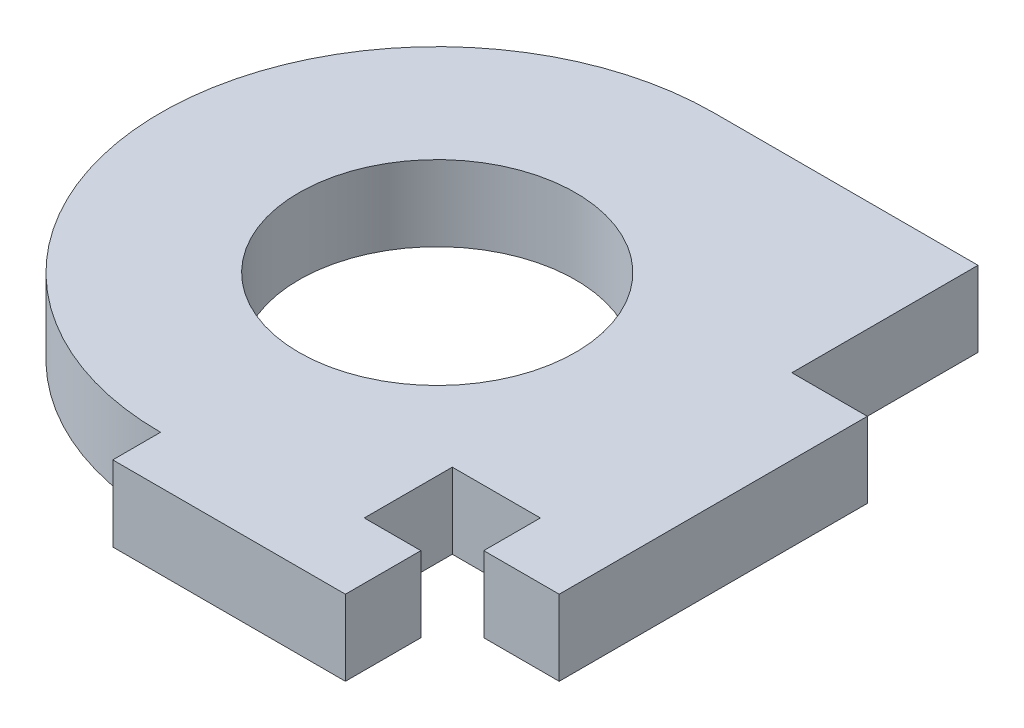
ISO-10303-21;
HEADER;
FILE_DESCRIPTION(('STEP AP214'),'2;1');
FILE_NAME('part.step','',(''),(''),'','','');
FILE_SCHEMA(('AUTOMOTIVE_DESIGN { 1 0 10303 214 1 1 1 1 }'));
ENDSEC;
DATA;
#1=APPLICATION_CONTEXT('core data for automotive mechanical design processes');
#2=APPLICATION_PROTOCOL_DEFINITION('international standard','automotive_design',2000,#1);
#3=PRODUCT_CONTEXT('',#1,'mechanical');
#4=PRODUCT('Part','Part','',(#3));
#5=PRODUCT_RELATED_PRODUCT_CATEGORY('part','',(#4));
#6=PRODUCT_DEFINITION_FORMATION('','',#4);
#7=PRODUCT_DEFINITION_CONTEXT('part definition',#1,'design');
#8=PRODUCT_DEFINITION('design','',#6,#7);
#9=PRODUCT_DEFINITION_SHAPE('','',#8);
#10=(LENGTH_UNIT() NAMED_UNIT(*) SI_UNIT(.MILLI.,.METRE.));
#11=(NAMED_UNIT(*) PLANE_ANGLE_UNIT() SI_UNIT($,.RADIAN.));
#12=(NAMED_UNIT(*) SI_UNIT($,.STERADIAN.) SOLID_ANGLE_UNIT());
#13=UNCERTAINTY_MEASURE_WITH_UNIT(LENGTH_MEASURE(1.E-05),#10,'distance_accuracy_value','');
#14=(GEOMETRIC_REPRESENTATION_CONTEXT(3) GLOBAL_UNCERTAINTY_ASSIGNED_CONTEXT((#13)) GLOBAL_UNIT_ASSIGNED_CONTEXT((#10,
#11,#12)) REPRESENTATION_CONTEXT('',''));
#15=CARTESIAN_POINT('',(0.,0.,0.));
#16=DIRECTION('',(0.,0.,1.));
#17=DIRECTION('',(1.,0.,0.));
#18=AXIS2_PLACEMENT_3D('',#15,#16,#17);
#19=CARTESIAN_POINT('',(-14.,6.,-19.8));
#20=DIRECTION('',(0.,1.,0.));
#21=DIRECTION('',(0.,0.,1.));
#22=AXIS2_PLACEMENT_3D('',#19,#20,#21);
#23=PLANE('',#22);
#24=DIRECTION('',(-1.,0.,0.));
#25=VECTOR('',#24,1.);
#26=CARTESIAN_POINT('',(0.,6.,0.));
#27=LINE('',#26,#25);
#28=CARTESIAN_POINT('',(4.5,6.,0.));
#29=VERTEX_POINT('',#28);
#30=CARTESIAN_POINT('',(0.,6.,0.));
#31=VERTEX_POINT('',#30);
#32=EDGE_CURVE('E187',#29,#31,#27,.T.);
#33=ORIENTED_EDGE('',*,*,#32,.T.);
#34=DIRECTION('',(0.,0.,-1.));
#35=VECTOR('',#34,1.);
#36=CARTESIAN_POINT('',(0.,6.,0.));
#37=LINE('',#36,#35);
#38=CARTESIAN_POINT('',(0.,6.,-7.));
#39=VERTEX_POINT('',#38);
#40=EDGE_CURVE('E110',#31,#39,#37,.T.);
#41=ORIENTED_EDGE('',*,*,#40,.T.);
#42=DIRECTION('',(1.,0.,0.));
#43=VECTOR('',#42,1.);
#44=CARTESIAN_POINT('',(0.,6.,-7.));
#45=LINE('',#44,#43);
#46=CARTESIAN_POINT('',(7.,6.,-7.));
#47=VERTEX_POINT('',#46);
#48=EDGE_CURVE('E217',#39,#47,#45,.T.);
#49=ORIENTED_EDGE('',*,*,#48,.T.);
#50=DIRECTION('',(0.,0.,1.));
#51=VECTOR('',#50,1.);
#52=CARTESIAN_POINT('',(7.,6.,-7.));
#53=LINE('',#52,#51);
#54=CARTESIAN_POINT('',(7.,6.,-2.5));
#55=VERTEX_POINT('',#54);
#56=EDGE_CURVE('E236',#47,#55,#53,.T.);
#57=ORIENTED_EDGE('',*,*,#56,.T.);
#58=DIRECTION('',(1.,0.,0.));
#59=VECTOR('',#58,1.);
#60=CARTESIAN_POINT('',(7.,6.,-2.5));
#61=LINE('',#60,#59);
#62=CARTESIAN_POINT('',(13.,6.,-2.5));
#63=VERTEX_POINT('',#62);
#64=EDGE_CURVE('E233',#55,#63,#61,.T.);
#65=ORIENTED_EDGE('',*,*,#64,.T.);
#66=DIRECTION('',(0.,0.,-1.));
#67=VECTOR('',#66,1.);
#68=CARTESIAN_POINT('',(13.,6.,-2.5));
#69=LINE('',#68,#67);
#70=CARTESIAN_POINT('',(13.,6.,-27.));
#71=VERTEX_POINT('',#70);
#72=EDGE_CURVE('E235',#63,#71,#69,.T.);
#73=ORIENTED_EDGE('',*,*,#72,.T.);
#74=DIRECTION('',(-1.,0.,0.));
#75=VECTOR('',#74,1.);
#76=CARTESIAN_POINT('',(7.,6.,-27.));
#77=LINE('',#76,#75);
#78=CARTESIAN_POINT('',(7.,6.,-27.));
#79=VERTEX_POINT('',#78);
#80=EDGE_CURVE('E238',#71,#79,#77,.T.);
#81=ORIENTED_EDGE('',*,*,#80,.T.);
#82=DIRECTION('',(0.,0.,-1.));
#83=VECTOR('',#82,1.);
#84=CARTESIAN_POINT('',(7.,6.,-41.8));
#85=LINE('',#84,#83);
#86=CARTESIAN_POINT('',(7.,6.,-41.8));
#87=VERTEX_POINT('',#86);
#88=EDGE_CURVE('E244',#79,#87,#85,.T.);
#89=ORIENTED_EDGE('',*,*,#88,.T.);
#90=DIRECTION('',(-1.,0.,0.));
#91=VECTOR('',#90,1.);
#92=CARTESIAN_POINT('',(-14.,6.,-41.8));
#93=LINE('',#92,#91);
#94=CARTESIAN_POINT('',(-14.,6.,-41.8));
#95=VERTEX_POINT('',#94);
#96=EDGE_CURVE('E246',#87,#95,#93,.T.);
#97=ORIENTED_EDGE('',*,*,#96,.T.);
#98=CARTESIAN_POINT('',(-14.,6.,-19.8));
#99=DIRECTION('',(0.,1.,0.));
#100=DIRECTION('',(0.,0.,1.));
#101=AXIS2_PLACEMENT_3D('',#98,#99,#100);
#102=CIRCLE('',#101,22.);
#103=CARTESIAN_POINT('',(-14.,6.,2.2));
#104=VERTEX_POINT('',#103);
#105=EDGE_CURVE('E144',#95,#104,#102,.T.);
#106=ORIENTED_EDGE('',*,*,#105,.T.);
#107=DIRECTION('',(0.,0.,1.));
#108=VECTOR('',#107,1.);
#109=CARTESIAN_POINT('',(-14.,6.,2.2));
#110=LINE('',#109,#108);
#111=CARTESIAN_POINT('',(-14.,6.,6.));
#112=VERTEX_POINT('',#111);
#113=EDGE_CURVE('E138',#104,#112,#110,.T.);
#114=ORIENTED_EDGE('',*,*,#113,.T.);
#115=DIRECTION('',(1.,0.,0.));
#116=VECTOR('',#115,1.);
#117=CARTESIAN_POINT('',(-14.,6.,6.));
#118=LINE('',#117,#116);
#119=CARTESIAN_POINT('',(4.50000000000001,6.,6.));
#120=VERTEX_POINT('',#119);
#121=EDGE_CURVE('E142',#112,#120,#118,.T.);
#122=ORIENTED_EDGE('',*,*,#121,.T.);
#123=DIRECTION('',(0.,0.,-1.));
#124=VECTOR('',#123,1.);
#125=CARTESIAN_POINT('',(4.5,6.,0.));
#126=LINE('',#125,#124);
#127=EDGE_CURVE('E52',#120,#29,#126,.T.);
#128=ORIENTED_EDGE('',*,*,#127,.T.);
#129=EDGE_LOOP('',(#33,#41,#49,#57,#65,#73,#81,#89,#97,#106,#114,#122,#128));
#130=FACE_BOUND('',#129,.T.);
#131=CARTESIAN_POINT('',(-14.,6.,-19.8));
#132=DIRECTION('',(0.,1.,0.));
#133=DIRECTION('',(0.,0.,1.));
#134=AXIS2_PLACEMENT_3D('',#131,#132,#133);
#135=CIRCLE('',#134,11.);
#136=CARTESIAN_POINT('',(-14.,6.,-8.8));
#137=VERTEX_POINT('',#136);
#138=EDGE_CURVE('E166',#137,#137,#135,.T.);
#139=ORIENTED_EDGE('',*,*,#138,.F.);
#140=EDGE_LOOP('',(#139));
#141=FACE_BOUND('',#140,.T.);
#142=ADVANCED_FACE('F35',(#130,#141),#23,.T.);
#143=CARTESIAN_POINT('',(-14.,0.,-19.8));
#144=DIRECTION('',(0.,1.,0.));
#145=DIRECTION('',(0.,0.,1.));
#146=AXIS2_PLACEMENT_3D('',#143,#144,#145);
#147=PLANE('',#146);
#148=DIRECTION('',(-1.,0.,0.));
#149=VECTOR('',#148,1.);
#150=CARTESIAN_POINT('',(0.,0.,0.));
#151=LINE('',#150,#149);
#152=CARTESIAN_POINT('',(4.5,0.,0.));
#153=VERTEX_POINT('',#152);
#154=CARTESIAN_POINT('',(0.,0.,0.));
#155=VERTEX_POINT('',#154);
#156=EDGE_CURVE('E162',#153,#155,#151,.T.);
#157=ORIENTED_EDGE('',*,*,#156,.F.);
#158=DIRECTION('',(0.,0.,-1.));
#159=VECTOR('',#158,1.);
#160=CARTESIAN_POINT('',(4.5,0.,0.));
#161=LINE('',#160,#159);
#162=CARTESIAN_POINT('',(4.50000000000001,0.,6.));
#163=VERTEX_POINT('',#162);
#164=EDGE_CURVE('E102',#163,#153,#161,.T.);
#165=ORIENTED_EDGE('',*,*,#164,.F.);
#166=DIRECTION('',(1.,0.,0.));
#167=VECTOR('',#166,1.);
#168=CARTESIAN_POINT('',(-14.,0.,6.));
#169=LINE('',#168,#167);
#170=CARTESIAN_POINT('',(-14.,0.,6.));
#171=VERTEX_POINT('',#170);
#172=EDGE_CURVE('E96',#171,#163,#169,.T.);
#173=ORIENTED_EDGE('',*,*,#172,.F.);
#174=DIRECTION('',(0.,0.,1.));
#175=VECTOR('',#174,1.);
#176=CARTESIAN_POINT('',(-14.,0.,2.2));
#177=LINE('',#176,#175);
#178=CARTESIAN_POINT('',(-14.,0.,2.2));
#179=VERTEX_POINT('',#178);
#180=EDGE_CURVE('E152',#179,#171,#177,.T.);
#181=ORIENTED_EDGE('',*,*,#180,.F.);
#182=CARTESIAN_POINT('',(-14.,0.,-19.8));
#183=DIRECTION('',(0.,1.,0.));
#184=DIRECTION('',(0.,0.,1.));
#185=AXIS2_PLACEMENT_3D('',#182,#183,#184);
#186=CIRCLE('',#185,22.);
#187=CARTESIAN_POINT('',(-14.,0.,-41.8));
#188=VERTEX_POINT('',#187);
#189=EDGE_CURVE('E182',#188,#179,#186,.T.);
#190=ORIENTED_EDGE('',*,*,#189,.F.);
#191=DIRECTION('',(-1.,0.,0.));
#192=VECTOR('',#191,1.);
#193=CARTESIAN_POINT('',(-14.,0.,-41.8));
#194=LINE('',#193,#192);
#195=CARTESIAN_POINT('',(7.,0.,-41.8));
#196=VERTEX_POINT('',#195);
#197=EDGE_CURVE('E180',#196,#188,#194,.T.);
#198=ORIENTED_EDGE('',*,*,#197,.F.);
#199=DIRECTION('',(0.,0.,-1.));
#200=VECTOR('',#199,1.);
#201=CARTESIAN_POINT('',(7.,0.,-41.8));
#202=LINE('',#201,#200);
#203=CARTESIAN_POINT('',(7.,0.,-27.));
#204=VERTEX_POINT('',#203);
#205=EDGE_CURVE('E178',#204,#196,#202,.T.);
#206=ORIENTED_EDGE('',*,*,#205,.F.);
#207=DIRECTION('',(-1.,0.,0.));
#208=VECTOR('',#207,1.);
#209=CARTESIAN_POINT('',(7.,0.,-27.));
#210=LINE('',#209,#208);
#211=CARTESIAN_POINT('',(13.,0.,-27.));
#212=VERTEX_POINT('',#211);
#213=EDGE_CURVE('E176',#212,#204,#210,.T.);
#214=ORIENTED_EDGE('',*,*,#213,.F.);
#215=DIRECTION('',(0.,0.,-1.));
#216=VECTOR('',#215,1.);
#217=CARTESIAN_POINT('',(13.,0.,-2.5));
#218=LINE('',#217,#216);
#219=CARTESIAN_POINT('',(13.,0.,-2.5));
#220=VERTEX_POINT('',#219);
#221=EDGE_CURVE('E174',#220,#212,#218,.T.);
#222=ORIENTED_EDGE('',*,*,#221,.F.);
#223=DIRECTION('',(1.,0.,0.));
#224=VECTOR('',#223,1.);
#225=CARTESIAN_POINT('',(7.,0.,-2.5));
#226=LINE('',#225,#224);
#227=CARTESIAN_POINT('',(7.,0.,-2.5));
#228=VERTEX_POINT('',#227);
#229=EDGE_CURVE('E172',#228,#220,#226,.T.);
#230=ORIENTED_EDGE('',*,*,#229,.F.);
#231=DIRECTION('',(0.,0.,1.));
#232=VECTOR('',#231,1.);
#233=CARTESIAN_POINT('',(7.,0.,-7.));
#234=LINE('',#233,#232);
#235=CARTESIAN_POINT('',(7.,0.,-7.));
#236=VERTEX_POINT('',#235);
#237=EDGE_CURVE('E170',#236,#228,#234,.T.);
#238=ORIENTED_EDGE('',*,*,#237,.F.);
#239=DIRECTION('',(1.,0.,0.));
#240=VECTOR('',#239,1.);
#241=CARTESIAN_POINT('',(0.,0.,-7.));
#242=LINE('',#241,#240);
#243=CARTESIAN_POINT('',(0.,0.,-7.));
#244=VERTEX_POINT('',#243);
#245=EDGE_CURVE('E168',#244,#236,#242,.T.);
#246=ORIENTED_EDGE('',*,*,#245,.F.);
#247=DIRECTION('',(0.,0.,-1.));
#248=VECTOR('',#247,1.);
#249=CARTESIAN_POINT('',(0.,0.,0.));
#250=LINE('',#249,#248);
#251=EDGE_CURVE('E165',#155,#244,#250,.T.);
#252=ORIENTED_EDGE('',*,*,#251,.F.);
#253=EDGE_LOOP('',(#157,#165,#173,#181,#190,#198,#206,#214,#222,#230,#238,#246,#252));
#254=FACE_BOUND('',#253,.T.);
#255=CARTESIAN_POINT('',(-14.,0.,-19.8));
#256=DIRECTION('',(0.,1.,0.));
#257=DIRECTION('',(0.,0.,1.));
#258=AXIS2_PLACEMENT_3D('',#255,#256,#257);
#259=CIRCLE('',#258,11.);
#260=CARTESIAN_POINT('',(-14.,0.,-8.8));
#261=VERTEX_POINT('',#260);
#262=EDGE_CURVE('E406',#261,#261,#259,.T.);
#263=ORIENTED_EDGE('',*,*,#262,.T.);
#264=EDGE_LOOP('',(#263));
#265=FACE_BOUND('',#264,.T.);
#266=ADVANCED_FACE('F221',(#254,#265),#147,.F.);
#267=CARTESIAN_POINT('',(0.,6.,0.));
#268=DIRECTION('',(0.,0.,1.));
#269=DIRECTION('',(1.,0.,0.));
#270=AXIS2_PLACEMENT_3D('',#267,#268,#269);
#271=PLANE('',#270);
#272=ORIENTED_EDGE('',*,*,#156,.T.);
#273=DIRECTION('',(0.,-1.,0.));
#274=VECTOR('',#273,1.);
#275=CARTESIAN_POINT('',(0.,6.,0.));
#276=LINE('',#275,#274);
#277=EDGE_CURVE('E11',#31,#155,#276,.T.);
#278=ORIENTED_EDGE('',*,*,#277,.F.);
#279=ORIENTED_EDGE('',*,*,#32,.F.);
#280=DIRECTION('',(0.,-1.,0.));
#281=VECTOR('',#280,1.);
#282=CARTESIAN_POINT('',(4.5,6.,0.));
#283=LINE('',#282,#281);
#284=EDGE_CURVE('E158',#29,#153,#283,.T.);
#285=ORIENTED_EDGE('',*,*,#284,.T.);
#286=EDGE_LOOP('',(#272,#278,#279,#285));
#287=FACE_BOUND('',#286,.T.);
#288=ADVANCED_FACE('F37',(#287),#271,.F.);
#289=CARTESIAN_POINT('',(0.,6.,0.));
#290=DIRECTION('',(-1.,0.,0.));
#291=DIRECTION('',(0.,0.,1.));
#292=AXIS2_PLACEMENT_3D('',#289,#290,#291);
#293=PLANE('',#292);
#294=ORIENTED_EDGE('',*,*,#251,.T.);
#295=DIRECTION('',(0.,-1.,0.));
#296=VECTOR('',#295,1.);
#297=CARTESIAN_POINT('',(0.,6.,-7.));
#298=LINE('',#297,#296);
#299=EDGE_CURVE('E44',#39,#244,#298,.T.);
#300=ORIENTED_EDGE('',*,*,#299,.F.);
#301=ORIENTED_EDGE('',*,*,#40,.F.);
#302=ORIENTED_EDGE('',*,*,#277,.T.);
#303=EDGE_LOOP('',(#294,#300,#301,#302));
#304=FACE_BOUND('',#303,.T.);
#305=ADVANCED_FACE('F280',(#304),#293,.F.);
#306=CARTESIAN_POINT('',(0.,6.,-7.));
#307=DIRECTION('',(0.,0.,-1.));
#308=DIRECTION('',(-1.,0.,0.));
#309=AXIS2_PLACEMENT_3D('',#306,#307,#308);
#310=PLANE('',#309);
#311=ORIENTED_EDGE('',*,*,#245,.T.);
#312=DIRECTION('',(0.,-1.,0.));
#313=VECTOR('',#312,1.);
#314=CARTESIAN_POINT('',(7.,6.,-7.));
#315=LINE('',#314,#313);
#316=EDGE_CURVE('E209',#47,#236,#315,.T.);
#317=ORIENTED_EDGE('',*,*,#316,.F.);
#318=ORIENTED_EDGE('',*,*,#48,.F.);
#319=ORIENTED_EDGE('',*,*,#299,.T.);
#320=EDGE_LOOP('',(#311,#317,#318,#319));
#321=FACE_BOUND('',#320,.T.);
#322=ADVANCED_FACE('F215',(#321),#310,.F.);
#323=CARTESIAN_POINT('',(7.,6.,-7.));
#324=DIRECTION('',(1.,0.,0.));
#325=DIRECTION('',(0.,0.,-1.));
#326=AXIS2_PLACEMENT_3D('',#323,#324,#325);
#327=PLANE('',#326);
#328=ORIENTED_EDGE('',*,*,#237,.T.);
#329=DIRECTION('',(0.,-1.,0.));
#330=VECTOR('',#329,1.);
#331=CARTESIAN_POINT('',(7.,6.,-2.5));
#332=LINE('',#331,#330);
#333=EDGE_CURVE('E206',#55,#228,#332,.T.);
#334=ORIENTED_EDGE('',*,*,#333,.F.);
#335=ORIENTED_EDGE('',*,*,#56,.F.);
#336=ORIENTED_EDGE('',*,*,#316,.T.);
#337=EDGE_LOOP('',(#328,#334,#335,#336));
#338=FACE_BOUND('',#337,.T.);
#339=ADVANCED_FACE('F227',(#338),#327,.F.);
#340=CARTESIAN_POINT('',(7.,6.,-2.5));
#341=DIRECTION('',(0.,0.,-1.));
#342=DIRECTION('',(-1.,0.,0.));
#343=AXIS2_PLACEMENT_3D('',#340,#341,#342);
#344=PLANE('',#343);
#345=ORIENTED_EDGE('',*,*,#229,.T.);
#346=DIRECTION('',(0.,-1.,0.));
#347=VECTOR('',#346,1.);
#348=CARTESIAN_POINT('',(13.,6.,-2.5));
#349=LINE('',#348,#347);
#350=EDGE_CURVE('E203',#63,#220,#349,.T.);
#351=ORIENTED_EDGE('',*,*,#350,.F.);
#352=ORIENTED_EDGE('',*,*,#64,.F.);
#353=ORIENTED_EDGE('',*,*,#333,.T.);
#354=EDGE_LOOP('',(#345,#351,#352,#353));
#355=FACE_BOUND('',#354,.T.);
#356=ADVANCED_FACE('F231',(#355),#344,.F.);
#357=CARTESIAN_POINT('',(13.,6.,-2.5));
#358=DIRECTION('',(-1.,0.,0.));
#359=DIRECTION('',(0.,0.,1.));
#360=AXIS2_PLACEMENT_3D('',#357,#358,#359);
#361=PLANE('',#360);
#362=ORIENTED_EDGE('',*,*,#221,.T.);
#363=DIRECTION('',(0.,-1.,0.));
#364=VECTOR('',#363,1.);
#365=CARTESIAN_POINT('',(13.,6.,-27.));
#366=LINE('',#365,#364);
#367=EDGE_CURVE('E200',#71,#212,#366,.T.);
#368=ORIENTED_EDGE('',*,*,#367,.F.);
#369=ORIENTED_EDGE('',*,*,#72,.F.);
#370=ORIENTED_EDGE('',*,*,#350,.T.);
#371=EDGE_LOOP('',(#362,#368,#369,#370));
#372=FACE_BOUND('',#371,.T.);
#373=ADVANCED_FACE('F293',(#372),#361,.F.);
#374=CARTESIAN_POINT('',(7.,6.,-27.));
#375=DIRECTION('',(0.,0.,1.));
#376=DIRECTION('',(1.,0.,0.));
#377=AXIS2_PLACEMENT_3D('',#374,#375,#376);
#378=PLANE('',#377);
#379=ORIENTED_EDGE('',*,*,#213,.T.);
#380=DIRECTION('',(0.,-1.,0.));
#381=VECTOR('',#380,1.);
#382=CARTESIAN_POINT('',(7.,6.,-27.));
#383=LINE('',#382,#381);
#384=EDGE_CURVE('E197',#79,#204,#383,.T.);
#385=ORIENTED_EDGE('',*,*,#384,.F.);
#386=ORIENTED_EDGE('',*,*,#80,.F.);
#387=ORIENTED_EDGE('',*,*,#367,.T.);
#388=EDGE_LOOP('',(#379,#385,#386,#387));
#389=FACE_BOUND('',#388,.T.);
#390=ADVANCED_FACE('F296',(#389),#378,.F.);
#391=CARTESIAN_POINT('',(7.,6.,-41.8));
#392=DIRECTION('',(-1.,0.,0.));
#393=DIRECTION('',(0.,0.,1.));
#394=AXIS2_PLACEMENT_3D('',#391,#392,#393);
#395=PLANE('',#394);
#396=ORIENTED_EDGE('',*,*,#205,.T.);
#397=DIRECTION('',(0.,-1.,0.));
#398=VECTOR('',#397,1.);
#399=CARTESIAN_POINT('',(7.,6.,-41.8));
#400=LINE('',#399,#398);
#401=EDGE_CURVE('E194',#87,#196,#400,.T.);
#402=ORIENTED_EDGE('',*,*,#401,.F.);
#403=ORIENTED_EDGE('',*,*,#88,.F.);
#404=ORIENTED_EDGE('',*,*,#384,.T.);
#405=EDGE_LOOP('',(#396,#402,#403,#404));
#406=FACE_BOUND('',#405,.T.);
#407=ADVANCED_FACE('F300',(#406),#395,.F.);
#408=CARTESIAN_POINT('',(-14.,6.,-41.8));
#409=DIRECTION('',(0.,0.,1.));
#410=DIRECTION('',(1.,0.,0.));
#411=AXIS2_PLACEMENT_3D('',#408,#409,#410);
#412=PLANE('',#411);
#413=ORIENTED_EDGE('',*,*,#197,.T.);
#414=DIRECTION('',(0.,-1.,0.));
#415=VECTOR('',#414,1.);
#416=CARTESIAN_POINT('',(-14.,6.,-41.8));
#417=LINE('',#416,#415);
#418=EDGE_CURVE('E191',#95,#188,#417,.T.);
#419=ORIENTED_EDGE('',*,*,#418,.F.);
#420=ORIENTED_EDGE('',*,*,#96,.F.);
#421=ORIENTED_EDGE('',*,*,#401,.T.);
#422=EDGE_LOOP('',(#413,#419,#420,#421));
#423=FACE_BOUND('',#422,.T.);
#424=ADVANCED_FACE('F252',(#423),#412,.F.);
#425=CARTESIAN_POINT('',(-14.,6.,-19.8));
#426=DIRECTION('',(0.,-1.,0.));
#427=DIRECTION('',(0.,0.,-1.));
#428=AXIS2_PLACEMENT_3D('',#425,#426,#427);
#429=CYLINDRICAL_SURFACE('',#428,22.);
#430=ORIENTED_EDGE('',*,*,#189,.T.);
#431=DIRECTION('',(0.,-1.,0.));
#432=VECTOR('',#431,1.);
#433=CARTESIAN_POINT('',(-14.,6.,2.2));
#434=LINE('',#433,#432);
#435=EDGE_CURVE('E153',#104,#179,#434,.T.);
#436=ORIENTED_EDGE('',*,*,#435,.F.);
#437=ORIENTED_EDGE('',*,*,#105,.F.);
#438=ORIENTED_EDGE('',*,*,#418,.T.);
#439=EDGE_LOOP('',(#430,#436,#437,#438));
#440=FACE_BOUND('',#439,.T.);
#441=ADVANCED_FACE('F256',(#440),#429,.T.);
#442=CARTESIAN_POINT('',(-14.,6.,2.2));
#443=DIRECTION('',(1.,0.,0.));
#444=DIRECTION('',(0.,0.,-1.));
#445=AXIS2_PLACEMENT_3D('',#442,#443,#444);
#446=PLANE('',#445);
#447=ORIENTED_EDGE('',*,*,#180,.T.);
#448=DIRECTION('',(0.,-1.,0.));
#449=VECTOR('',#448,1.);
#450=CARTESIAN_POINT('',(-14.,6.,6.));
#451=LINE('',#450,#449);
#452=EDGE_CURVE('E149',#112,#171,#451,.T.);
#453=ORIENTED_EDGE('',*,*,#452,.F.);
#454=ORIENTED_EDGE('',*,*,#113,.F.);
#455=ORIENTED_EDGE('',*,*,#435,.T.);
#456=EDGE_LOOP('',(#447,#453,#454,#455));
#457=FACE_BOUND('',#456,.T.);
#458=ADVANCED_FACE('F150',(#457),#446,.F.);
#459=CARTESIAN_POINT('',(-14.,6.,6.));
#460=DIRECTION('',(0.,0.,-1.));
#461=DIRECTION('',(-1.,0.,0.));
#462=AXIS2_PLACEMENT_3D('',#459,#460,#461);
#463=PLANE('',#462);
#464=ORIENTED_EDGE('',*,*,#172,.T.);
#465=DIRECTION('',(0.,-1.,0.));
#466=VECTOR('',#465,1.);
#467=CARTESIAN_POINT('',(4.50000000000001,6.,6.));
#468=LINE('',#467,#466);
#469=EDGE_CURVE('E154',#120,#163,#468,.T.);
#470=ORIENTED_EDGE('',*,*,#469,.F.);
#471=ORIENTED_EDGE('',*,*,#121,.F.);
#472=ORIENTED_EDGE('',*,*,#452,.T.);
#473=EDGE_LOOP('',(#464,#470,#471,#472));
#474=FACE_BOUND('',#473,.T.);
#475=ADVANCED_FACE('F156',(#474),#463,.F.);
#476=CARTESIAN_POINT('',(4.5,6.,0.));
#477=DIRECTION('',(-1.,0.,0.));
#478=DIRECTION('',(0.,0.,1.));
#479=AXIS2_PLACEMENT_3D('',#476,#477,#478);
#480=PLANE('',#479);
#481=ORIENTED_EDGE('',*,*,#164,.T.);
#482=ORIENTED_EDGE('',*,*,#284,.F.);
#483=ORIENTED_EDGE('',*,*,#127,.F.);
#484=ORIENTED_EDGE('',*,*,#469,.T.);
#485=EDGE_LOOP('',(#481,#482,#483,#484));
#486=FACE_BOUND('',#485,.T.);
#487=ADVANCED_FACE('F260',(#486),#480,.F.);
#488=CARTESIAN_POINT('',(-14.,6.,-19.8));
#489=DIRECTION('',(0.,-1.,0.));
#490=DIRECTION('',(0.,0.,-1.));
#491=AXIS2_PLACEMENT_3D('',#488,#489,#490);
#492=CYLINDRICAL_SURFACE('',#491,11.);
#493=ORIENTED_EDGE('',*,*,#138,.T.);
#494=EDGE_LOOP('',(#493));
#495=FACE_BOUND('',#494,.T.);
#496=ORIENTED_EDGE('',*,*,#262,.F.);
#497=EDGE_LOOP('',(#496));
#498=FACE_BOUND('',#497,.T.);
#499=ADVANCED_FACE('F262',(#495,#498),#492,.F.);
#500=CLOSED_SHELL('',(#142,#266,#288,#305,#322,#339,#356,#373,#390,#407,#424,#441,#458,#475,
#487,#499));
#501=MANIFOLD_SOLID_BREP('B2',#500);
#502=ADVANCED_BREP_SHAPE_REPRESENTATION('',(#18,#501),#14);
#503=SHAPE_DEFINITION_REPRESENTATION(#9,#502);
ENDSEC;
END-ISO-10303-21;
